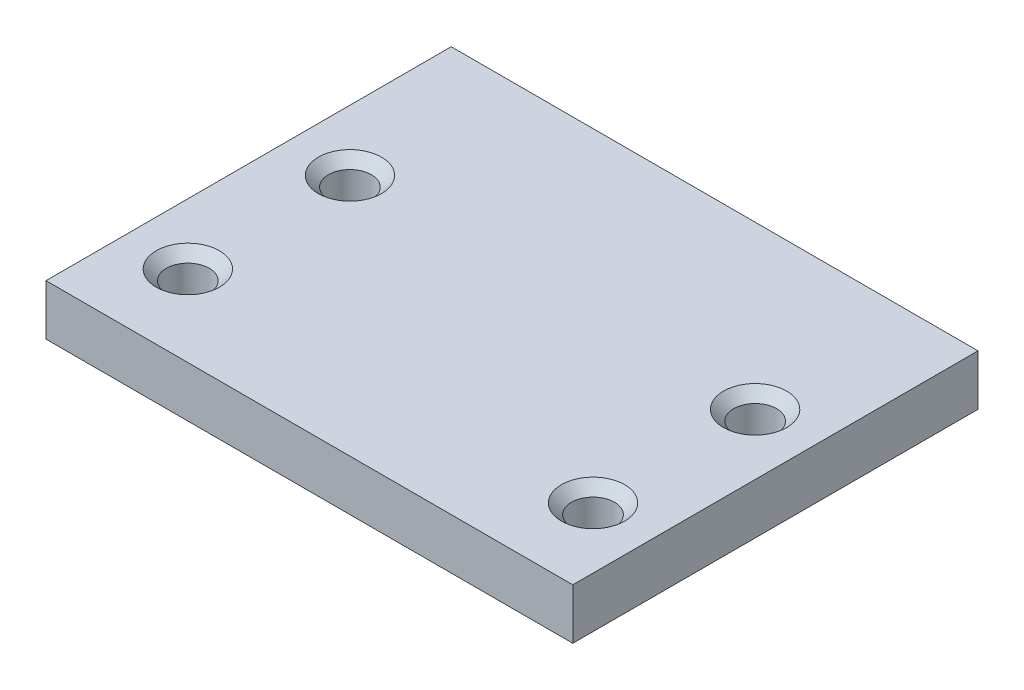
ISO-10303-21;
HEADER;
FILE_DESCRIPTION(('STEP AP214'),'2;1');
FILE_NAME('part.step','',(''),(''),'','','');
FILE_SCHEMA(('AUTOMOTIVE_DESIGN { 1 0 10303 214 1 1 1 1 }'));
ENDSEC;
DATA;
#1=APPLICATION_CONTEXT('core data for automotive mechanical design processes');
#2=APPLICATION_PROTOCOL_DEFINITION('international standard','automotive_design',2000,#1);
#3=PRODUCT_CONTEXT('',#1,'mechanical');
#4=PRODUCT('Part','Part','',(#3));
#5=PRODUCT_RELATED_PRODUCT_CATEGORY('part','',(#4));
#6=PRODUCT_DEFINITION_FORMATION('','',#4);
#7=PRODUCT_DEFINITION_CONTEXT('part definition',#1,'design');
#8=PRODUCT_DEFINITION('design','',#6,#7);
#9=PRODUCT_DEFINITION_SHAPE('','',#8);
#10=(LENGTH_UNIT() NAMED_UNIT(*) SI_UNIT(.MILLI.,.METRE.));
#11=(NAMED_UNIT(*) PLANE_ANGLE_UNIT() SI_UNIT($,.RADIAN.));
#12=(NAMED_UNIT(*) SI_UNIT($,.STERADIAN.) SOLID_ANGLE_UNIT());
#13=UNCERTAINTY_MEASURE_WITH_UNIT(LENGTH_MEASURE(1.E-05),#10,'distance_accuracy_value','');
#14=(GEOMETRIC_REPRESENTATION_CONTEXT(3) GLOBAL_UNCERTAINTY_ASSIGNED_CONTEXT((#13)) GLOBAL_UNIT_ASSIGNED_CONTEXT((#10,
#11,#12)) REPRESENTATION_CONTEXT('',''));
#15=CARTESIAN_POINT('',(0.,0.,0.));
#16=DIRECTION('',(0.,0.,1.));
#17=DIRECTION('',(1.,0.,0.));
#18=AXIS2_PLACEMENT_3D('',#15,#16,#17);
#19=CARTESIAN_POINT('',(0.,4.99999999999999,-20.));
#20=DIRECTION('',(0.,0.,1.));
#21=DIRECTION('',(1.,0.,0.));
#22=AXIS2_PLACEMENT_3D('',#19,#20,#21);
#23=PLANE('',#22);
#24=DIRECTION('',(-1.,0.,0.));
#25=VECTOR('',#24,1.);
#26=CARTESIAN_POINT('',(0.,0.,-20.));
#27=LINE('',#26,#25);
#28=CARTESIAN_POINT('',(26.,0.,-20.));
#29=VERTEX_POINT('',#28);
#30=CARTESIAN_POINT('',(-26.,0.,-20.));
#31=VERTEX_POINT('',#30);
#32=EDGE_CURVE('E116',#29,#31,#27,.T.);
#33=ORIENTED_EDGE('',*,*,#32,.T.);
#34=DIRECTION('',(0.,-1.,0.));
#35=VECTOR('',#34,1.);
#36=CARTESIAN_POINT('',(-26.,4.99999999999999,-20.));
#37=LINE('',#36,#35);
#38=CARTESIAN_POINT('',(-26.,4.99999999999999,-20.));
#39=VERTEX_POINT('',#38);
#40=EDGE_CURVE('E108',#39,#31,#37,.T.);
#41=ORIENTED_EDGE('',*,*,#40,.F.);
#42=DIRECTION('',(-1.,0.,0.));
#43=VECTOR('',#42,1.);
#44=CARTESIAN_POINT('',(0.,4.99999999999999,-20.));
#45=LINE('',#44,#43);
#46=CARTESIAN_POINT('',(26.,4.99999999999999,-20.));
#47=VERTEX_POINT('',#46);
#48=EDGE_CURVE('E99',#47,#39,#45,.T.);
#49=ORIENTED_EDGE('',*,*,#48,.F.);
#50=DIRECTION('',(0.,-1.,0.));
#51=VECTOR('',#50,1.);
#52=CARTESIAN_POINT('',(26.,4.99999999999999,-20.));
#53=LINE('',#52,#51);
#54=EDGE_CURVE('E65',#47,#29,#53,.T.);
#55=ORIENTED_EDGE('',*,*,#54,.T.);
#56=EDGE_LOOP('',(#33,#41,#49,#55));
#57=FACE_BOUND('',#56,.T.);
#58=ADVANCED_FACE('F47',(#57),#23,.F.);
#59=CARTESIAN_POINT('',(-26.,4.99999999999999,0.));
#60=DIRECTION('',(1.,0.,0.));
#61=DIRECTION('',(0.,0.,-1.));
#62=AXIS2_PLACEMENT_3D('',#59,#60,#61);
#63=PLANE('',#62);
#64=DIRECTION('',(0.,0.,1.));
#65=VECTOR('',#64,1.);
#66=CARTESIAN_POINT('',(-26.,0.,0.));
#67=LINE('',#66,#65);
#68=CARTESIAN_POINT('',(-26.,0.,20.));
#69=VERTEX_POINT('',#68);
#70=EDGE_CURVE('E105',#31,#69,#67,.T.);
#71=ORIENTED_EDGE('',*,*,#70,.T.);
#72=DIRECTION('',(0.,-1.,0.));
#73=VECTOR('',#72,1.);
#74=CARTESIAN_POINT('',(-26.,4.99999999999999,20.));
#75=LINE('',#74,#73);
#76=CARTESIAN_POINT('',(-26.,4.99999999999999,20.));
#77=VERTEX_POINT('',#76);
#78=EDGE_CURVE('E103',#77,#69,#75,.T.);
#79=ORIENTED_EDGE('',*,*,#78,.F.);
#80=DIRECTION('',(0.,0.,1.));
#81=VECTOR('',#80,1.);
#82=CARTESIAN_POINT('',(-26.,4.99999999999999,0.));
#83=LINE('',#82,#81);
#84=EDGE_CURVE('E92',#39,#77,#83,.T.);
#85=ORIENTED_EDGE('',*,*,#84,.F.);
#86=ORIENTED_EDGE('',*,*,#40,.T.);
#87=EDGE_LOOP('',(#71,#79,#85,#86));
#88=FACE_BOUND('',#87,.T.);
#89=ADVANCED_FACE('F104',(#88),#63,.F.);
#90=CARTESIAN_POINT('',(0.,4.99999999999999,20.));
#91=DIRECTION('',(0.,0.,-1.));
#92=DIRECTION('',(-1.,0.,0.));
#93=AXIS2_PLACEMENT_3D('',#90,#91,#92);
#94=PLANE('',#93);
#95=DIRECTION('',(1.,0.,0.));
#96=VECTOR('',#95,1.);
#97=CARTESIAN_POINT('',(0.,0.,20.));
#98=LINE('',#97,#96);
#99=CARTESIAN_POINT('',(26.,0.,20.));
#100=VERTEX_POINT('',#99);
#101=EDGE_CURVE('E120',#69,#100,#98,.T.);
#102=ORIENTED_EDGE('',*,*,#101,.T.);
#103=DIRECTION('',(0.,-1.,0.));
#104=VECTOR('',#103,1.);
#105=CARTESIAN_POINT('',(26.,4.99999999999999,20.));
#106=LINE('',#105,#104);
#107=CARTESIAN_POINT('',(26.,4.99999999999999,20.));
#108=VERTEX_POINT('',#107);
#109=EDGE_CURVE('E80',#108,#100,#106,.T.);
#110=ORIENTED_EDGE('',*,*,#109,.F.);
#111=DIRECTION('',(1.,0.,0.));
#112=VECTOR('',#111,1.);
#113=CARTESIAN_POINT('',(0.,4.99999999999999,20.));
#114=LINE('',#113,#112);
#115=EDGE_CURVE('E98',#77,#108,#114,.T.);
#116=ORIENTED_EDGE('',*,*,#115,.F.);
#117=ORIENTED_EDGE('',*,*,#78,.T.);
#118=EDGE_LOOP('',(#102,#110,#116,#117));
#119=FACE_BOUND('',#118,.T.);
#120=ADVANCED_FACE('F110',(#119),#94,.F.);
#121=CARTESIAN_POINT('',(26.,4.99999999999999,0.));
#122=DIRECTION('',(1.,0.,0.));
#123=DIRECTION('',(0.,0.,-1.));
#124=AXIS2_PLACEMENT_3D('',#121,#122,#123);
#125=PLANE('',#124);
#126=DIRECTION('',(0.,0.,1.));
#127=VECTOR('',#126,1.);
#128=CARTESIAN_POINT('',(26.,0.,0.));
#129=LINE('',#128,#127);
#130=EDGE_CURVE('E122',#29,#100,#129,.T.);
#131=ORIENTED_EDGE('',*,*,#130,.F.);
#132=ORIENTED_EDGE('',*,*,#54,.F.);
#133=DIRECTION('',(0.,0.,1.));
#134=VECTOR('',#133,1.);
#135=CARTESIAN_POINT('',(26.,4.99999999999999,0.));
#136=LINE('',#135,#134);
#137=EDGE_CURVE('E111',#47,#108,#136,.T.);
#138=ORIENTED_EDGE('',*,*,#137,.T.);
#139=ORIENTED_EDGE('',*,*,#109,.T.);
#140=EDGE_LOOP('',(#131,#132,#138,#139));
#141=FACE_BOUND('',#140,.T.);
#142=ADVANCED_FACE('F200',(#141),#125,.T.);
#143=CARTESIAN_POINT('',(0.,4.99999999999999,0.));
#144=DIRECTION('',(0.,1.,0.));
#145=DIRECTION('',(0.,0.,1.));
#146=AXIS2_PLACEMENT_3D('',#143,#144,#145);
#147=PLANE('',#146);
#148=CARTESIAN_POINT('',(20.,4.99999999999999,12.));
#149=DIRECTION('',(0.,1.,0.));
#150=DIRECTION('',(0.,0.,1.));
#151=AXIS2_PLACEMENT_3D('',#148,#149,#150);
#152=CIRCLE('',#151,3.11999999999998);
#153=CARTESIAN_POINT('',(20.,4.99999999999999,15.12));
#154=VERTEX_POINT('',#153);
#155=EDGE_CURVE('E57',#154,#154,#152,.F.);
#156=ORIENTED_EDGE('',*,*,#155,.T.);
#157=EDGE_LOOP('',(#156));
#158=FACE_BOUND('',#157,.T.);
#159=CARTESIAN_POINT('',(-20.,4.99999999999999,12.));
#160=DIRECTION('',(0.,1.,0.));
#161=DIRECTION('',(0.,0.,1.));
#162=AXIS2_PLACEMENT_3D('',#159,#160,#161);
#163=CIRCLE('',#162,3.11999999999998);
#164=CARTESIAN_POINT('',(-20.,4.99999999999999,15.12));
#165=VERTEX_POINT('',#164);
#166=EDGE_CURVE('E140',#165,#165,#163,.F.);
#167=ORIENTED_EDGE('',*,*,#166,.T.);
#168=EDGE_LOOP('',(#167));
#169=FACE_BOUND('',#168,.T.);
#170=CARTESIAN_POINT('',(-20.,4.99999999999999,-4.));
#171=DIRECTION('',(0.,1.,0.));
#172=DIRECTION('',(0.,0.,1.));
#173=AXIS2_PLACEMENT_3D('',#170,#171,#172);
#174=CIRCLE('',#173,3.12);
#175=CARTESIAN_POINT('',(-20.,4.99999999999999,-0.88));
#176=VERTEX_POINT('',#175);
#177=EDGE_CURVE('E134',#176,#176,#174,.F.);
#178=ORIENTED_EDGE('',*,*,#177,.T.);
#179=EDGE_LOOP('',(#178));
#180=FACE_BOUND('',#179,.T.);
#181=CARTESIAN_POINT('',(20.,4.99999999999999,-4.));
#182=DIRECTION('',(0.,1.,0.));
#183=DIRECTION('',(0.,0.,1.));
#184=AXIS2_PLACEMENT_3D('',#181,#182,#183);
#185=CIRCLE('',#184,3.12);
#186=CARTESIAN_POINT('',(20.,4.99999999999999,-0.879999999999992));
#187=VERTEX_POINT('',#186);
#188=EDGE_CURVE('E131',#187,#187,#185,.F.);
#189=ORIENTED_EDGE('',*,*,#188,.T.);
#190=EDGE_LOOP('',(#189));
#191=FACE_BOUND('',#190,.T.);
#192=ORIENTED_EDGE('',*,*,#48,.T.);
#193=ORIENTED_EDGE('',*,*,#84,.T.);
#194=ORIENTED_EDGE('',*,*,#115,.T.);
#195=ORIENTED_EDGE('',*,*,#137,.F.);
#196=EDGE_LOOP('',(#192,#193,#194,#195));
#197=FACE_BOUND('',#196,.T.);
#198=ADVANCED_FACE('F95',(#158,#169,#180,#191,#197),#147,.T.);
#199=CARTESIAN_POINT('',(0.,0.,0.));
#200=DIRECTION('',(0.,1.,0.));
#201=DIRECTION('',(0.,0.,1.));
#202=AXIS2_PLACEMENT_3D('',#199,#200,#201);
#203=PLANE('',#202);
#204=CARTESIAN_POINT('',(-20.,0.,-4.));
#205=DIRECTION('',(0.,1.,0.));
#206=DIRECTION('',(0.,0.,1.));
#207=AXIS2_PLACEMENT_3D('',#204,#205,#206);
#208=CIRCLE('',#207,2.12);
#209=CARTESIAN_POINT('',(-20.,0.,-1.88));
#210=VERTEX_POINT('',#209);
#211=EDGE_CURVE('E220',#210,#210,#208,.T.);
#212=ORIENTED_EDGE('',*,*,#211,.T.);
#213=EDGE_LOOP('',(#212));
#214=FACE_BOUND('',#213,.T.);
#215=CARTESIAN_POINT('',(-20.,0.,12.));
#216=DIRECTION('',(0.,1.,0.));
#217=DIRECTION('',(0.,0.,1.));
#218=AXIS2_PLACEMENT_3D('',#215,#216,#217);
#219=CIRCLE('',#218,2.12);
#220=CARTESIAN_POINT('',(-20.,0.,14.12));
#221=VERTEX_POINT('',#220);
#222=EDGE_CURVE('E215',#221,#221,#219,.T.);
#223=ORIENTED_EDGE('',*,*,#222,.T.);
#224=EDGE_LOOP('',(#223));
#225=FACE_BOUND('',#224,.T.);
#226=CARTESIAN_POINT('',(20.,0.,12.));
#227=DIRECTION('',(0.,-1.,0.));
#228=DIRECTION('',(0.,0.,-1.));
#229=AXIS2_PLACEMENT_3D('',#226,#227,#228);
#230=CIRCLE('',#229,2.12);
#231=CARTESIAN_POINT('',(20.,0.,9.88));
#232=VERTEX_POINT('',#231);
#233=EDGE_CURVE('E212',#232,#232,#230,.T.);
#234=ORIENTED_EDGE('',*,*,#233,.F.);
#235=EDGE_LOOP('',(#234));
#236=FACE_BOUND('',#235,.T.);
#237=CARTESIAN_POINT('',(20.,0.,-4.));
#238=DIRECTION('',(0.,-1.,0.));
#239=DIRECTION('',(0.,0.,-1.));
#240=AXIS2_PLACEMENT_3D('',#237,#238,#239);
#241=CIRCLE('',#240,2.12);
#242=CARTESIAN_POINT('',(20.,0.,-6.12));
#243=VERTEX_POINT('',#242);
#244=EDGE_CURVE('E118',#243,#243,#241,.T.);
#245=ORIENTED_EDGE('',*,*,#244,.F.);
#246=EDGE_LOOP('',(#245));
#247=FACE_BOUND('',#246,.T.);
#248=ORIENTED_EDGE('',*,*,#32,.F.);
#249=ORIENTED_EDGE('',*,*,#130,.T.);
#250=ORIENTED_EDGE('',*,*,#101,.F.);
#251=ORIENTED_EDGE('',*,*,#70,.F.);
#252=EDGE_LOOP('',(#248,#249,#250,#251));
#253=FACE_BOUND('',#252,.T.);
#254=ADVANCED_FACE('F199',(#214,#225,#236,#247,#253),#203,.F.);
#255=CARTESIAN_POINT('',(20.,6.99999999999999,-4.));
#256=DIRECTION('',(0.,-1.,0.));
#257=DIRECTION('',(0.,0.,-1.));
#258=AXIS2_PLACEMENT_3D('',#255,#256,#257);
#259=CYLINDRICAL_SURFACE('',#258,2.12);
#260=CARTESIAN_POINT('',(20.,4.,-4.));
#261=DIRECTION('',(0.,1.,0.));
#262=DIRECTION('',(0.,0.,1.));
#263=AXIS2_PLACEMENT_3D('',#260,#261,#262);
#264=CIRCLE('',#263,2.12);
#265=CARTESIAN_POINT('',(20.,4.,-1.88));
#266=VERTEX_POINT('',#265);
#267=EDGE_CURVE('E128',#266,#266,#264,.T.);
#268=ORIENTED_EDGE('',*,*,#267,.T.);
#269=EDGE_LOOP('',(#268));
#270=FACE_BOUND('',#269,.T.);
#271=ORIENTED_EDGE('',*,*,#244,.T.);
#272=EDGE_LOOP('',(#271));
#273=FACE_BOUND('',#272,.T.);
#274=ADVANCED_FACE('F175',(#270,#273),#259,.F.);
#275=CARTESIAN_POINT('',(20.,4.,-4.));
#276=DIRECTION('',(0.,1.,0.));
#277=DIRECTION('',(0.,0.,1.));
#278=AXIS2_PLACEMENT_3D('',#275,#276,#277);
#279=CONICAL_SURFACE('',#278,2.12,0.785398163397452);
#280=ORIENTED_EDGE('',*,*,#188,.F.);
#281=EDGE_LOOP('',(#280));
#282=FACE_BOUND('',#281,.T.);
#283=ORIENTED_EDGE('',*,*,#267,.F.);
#284=EDGE_LOOP('',(#283));
#285=FACE_BOUND('',#284,.T.);
#286=ADVANCED_FACE('F168',(#282,#285),#279,.F.);
#287=CARTESIAN_POINT('',(20.,4.99999999999999,12.));
#288=DIRECTION('',(0.,-1.,0.));
#289=DIRECTION('',(0.,0.,-1.));
#290=AXIS2_PLACEMENT_3D('',#287,#288,#289);
#291=CYLINDRICAL_SURFACE('',#290,2.12);
#292=CARTESIAN_POINT('',(20.,4.00000000000001,12.));
#293=DIRECTION('',(0.,1.,0.));
#294=DIRECTION('',(0.,0.,1.));
#295=AXIS2_PLACEMENT_3D('',#292,#293,#294);
#296=CIRCLE('',#295,2.12);
#297=CARTESIAN_POINT('',(20.,4.00000000000001,14.12));
#298=VERTEX_POINT('',#297);
#299=EDGE_CURVE('E11',#298,#298,#296,.T.);
#300=ORIENTED_EDGE('',*,*,#299,.T.);
#301=EDGE_LOOP('',(#300));
#302=FACE_BOUND('',#301,.T.);
#303=ORIENTED_EDGE('',*,*,#233,.T.);
#304=EDGE_LOOP('',(#303));
#305=FACE_BOUND('',#304,.T.);
#306=ADVANCED_FACE('F174',(#302,#305),#291,.F.);
#307=CARTESIAN_POINT('',(-20.,18.,12.));
#308=DIRECTION('',(0.,-1.,0.));
#309=DIRECTION('',(0.,0.,-1.));
#310=AXIS2_PLACEMENT_3D('',#307,#308,#309);
#311=CYLINDRICAL_SURFACE('',#310,2.12);
#312=CARTESIAN_POINT('',(-20.,4.00000000000001,12.));
#313=DIRECTION('',(0.,1.,0.));
#314=DIRECTION('',(0.,0.,1.));
#315=AXIS2_PLACEMENT_3D('',#312,#313,#314);
#316=CIRCLE('',#315,2.12);
#317=CARTESIAN_POINT('',(-20.,4.00000000000001,14.12));
#318=VERTEX_POINT('',#317);
#319=EDGE_CURVE('E143',#318,#318,#316,.T.);
#320=ORIENTED_EDGE('',*,*,#319,.T.);
#321=EDGE_LOOP('',(#320));
#322=FACE_BOUND('',#321,.T.);
#323=ORIENTED_EDGE('',*,*,#222,.F.);
#324=EDGE_LOOP('',(#323));
#325=FACE_BOUND('',#324,.T.);
#326=ADVANCED_FACE('F190',(#322,#325),#311,.F.);
#327=CARTESIAN_POINT('',(-20.,14.,-4.));
#328=DIRECTION('',(0.,-1.,0.));
#329=DIRECTION('',(0.,0.,-1.));
#330=AXIS2_PLACEMENT_3D('',#327,#328,#329);
#331=CYLINDRICAL_SURFACE('',#330,2.12);
#332=CARTESIAN_POINT('',(-20.,3.99999999999999,-4.));
#333=DIRECTION('',(0.,1.,0.));
#334=DIRECTION('',(0.,0.,1.));
#335=AXIS2_PLACEMENT_3D('',#332,#333,#334);
#336=CIRCLE('',#335,2.12);
#337=CARTESIAN_POINT('',(-20.,3.99999999999999,-1.88));
#338=VERTEX_POINT('',#337);
#339=EDGE_CURVE('E137',#338,#338,#336,.T.);
#340=ORIENTED_EDGE('',*,*,#339,.T.);
#341=EDGE_LOOP('',(#340));
#342=FACE_BOUND('',#341,.T.);
#343=ORIENTED_EDGE('',*,*,#211,.F.);
#344=EDGE_LOOP('',(#343));
#345=FACE_BOUND('',#344,.T.);
#346=ADVANCED_FACE('F181',(#342,#345),#331,.F.);
#347=CARTESIAN_POINT('',(-20.,4.99999999999999,-4.));
#348=DIRECTION('',(0.,1.,0.));
#349=DIRECTION('',(0.,0.,1.));
#350=AXIS2_PLACEMENT_3D('',#347,#348,#349);
#351=CONICAL_SURFACE('',#350,3.12,0.785398163397445);
#352=ORIENTED_EDGE('',*,*,#339,.F.);
#353=EDGE_LOOP('',(#352));
#354=FACE_BOUND('',#353,.T.);
#355=ORIENTED_EDGE('',*,*,#177,.F.);
#356=EDGE_LOOP('',(#355));
#357=FACE_BOUND('',#356,.T.);
#358=ADVANCED_FACE('F156',(#354,#357),#351,.F.);
#359=CARTESIAN_POINT('',(-20.,4.99999999999999,12.));
#360=DIRECTION('',(0.,1.,0.));
#361=DIRECTION('',(0.,0.,1.));
#362=AXIS2_PLACEMENT_3D('',#359,#360,#361);
#363=CONICAL_SURFACE('',#362,3.11999999999998,0.785398163397444);
#364=ORIENTED_EDGE('',*,*,#319,.F.);
#365=EDGE_LOOP('',(#364));
#366=FACE_BOUND('',#365,.T.);
#367=ORIENTED_EDGE('',*,*,#166,.F.);
#368=EDGE_LOOP('',(#367));
#369=FACE_BOUND('',#368,.T.);
#370=ADVANCED_FACE('F151',(#366,#369),#363,.F.);
#371=CARTESIAN_POINT('',(20.,4.99999999999999,12.));
#372=DIRECTION('',(0.,1.,0.));
#373=DIRECTION('',(0.,0.,1.));
#374=AXIS2_PLACEMENT_3D('',#371,#372,#373);
#375=CONICAL_SURFACE('',#374,3.11999999999998,0.785398163397445);
#376=ORIENTED_EDGE('',*,*,#299,.F.);
#377=EDGE_LOOP('',(#376));
#378=FACE_BOUND('',#377,.T.);
#379=ORIENTED_EDGE('',*,*,#155,.F.);
#380=EDGE_LOOP('',(#379));
#381=FACE_BOUND('',#380,.T.);
#382=ADVANCED_FACE('F50',(#378,#381),#375,.F.);
#383=CLOSED_SHELL('',(#58,#89,#120,#142,#198,#254,#274,#286,#306,#326,#346,#358,#370,#382));
#384=MANIFOLD_SOLID_BREP('B2',#383);
#385=ADVANCED_BREP_SHAPE_REPRESENTATION('',(#18,#384),#14);
#386=SHAPE_DEFINITION_REPRESENTATION(#9,#385);
ENDSEC;
END-ISO-10303-21;
